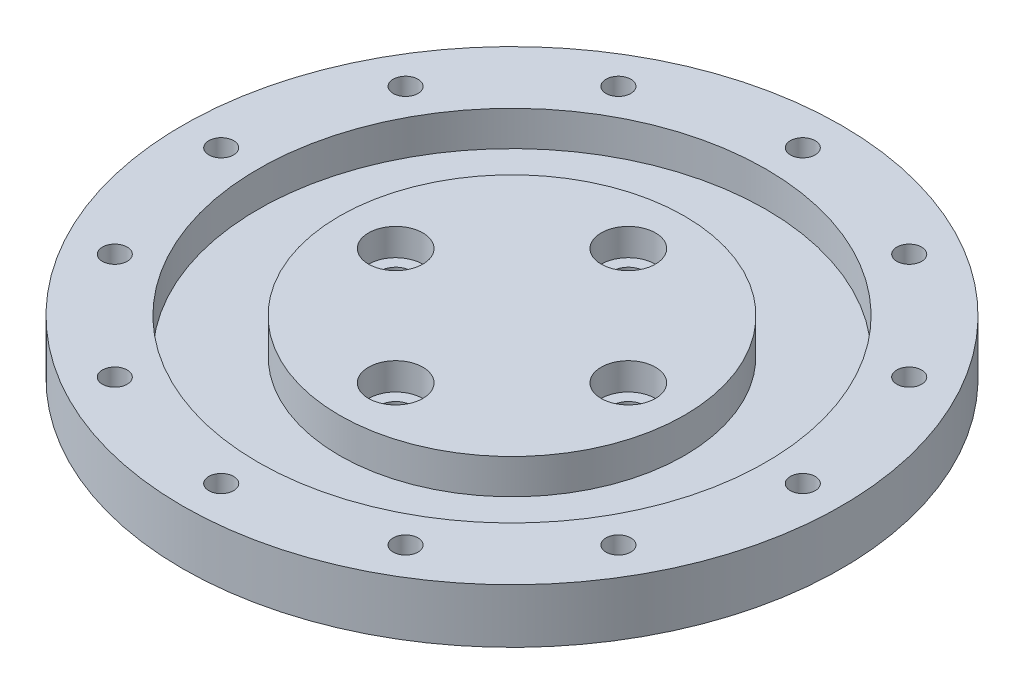
ISO-10303-21;
HEADER;
FILE_DESCRIPTION(('STEP AP214'),'2;1');
FILE_NAME('part.step','',(''),(''),'','','');
FILE_SCHEMA(('AUTOMOTIVE_DESIGN { 1 0 10303 214 1 1 1 1 }'));
ENDSEC;
DATA;
#1=APPLICATION_CONTEXT('core data for automotive mechanical design processes');
#2=APPLICATION_PROTOCOL_DEFINITION('international standard','automotive_design',2000,#1);
#3=PRODUCT_CONTEXT('',#1,'mechanical');
#4=PRODUCT('Part','Part','',(#3));
#5=PRODUCT_RELATED_PRODUCT_CATEGORY('part','',(#4));
#6=PRODUCT_DEFINITION_FORMATION('','',#4);
#7=PRODUCT_DEFINITION_CONTEXT('part definition',#1,'design');
#8=PRODUCT_DEFINITION('design','',#6,#7);
#9=PRODUCT_DEFINITION_SHAPE('','',#8);
#10=(LENGTH_UNIT() NAMED_UNIT(*) SI_UNIT(.MILLI.,.METRE.));
#11=(NAMED_UNIT(*) PLANE_ANGLE_UNIT() SI_UNIT($,.RADIAN.));
#12=(NAMED_UNIT(*) SI_UNIT($,.STERADIAN.) SOLID_ANGLE_UNIT());
#13=UNCERTAINTY_MEASURE_WITH_UNIT(LENGTH_MEASURE(1.E-05),#10,'distance_accuracy_value','');
#14=(GEOMETRIC_REPRESENTATION_CONTEXT(3) GLOBAL_UNCERTAINTY_ASSIGNED_CONTEXT((#13)) GLOBAL_UNIT_ASSIGNED_CONTEXT((#10,
#11,#12)) REPRESENTATION_CONTEXT('',''));
#15=CARTESIAN_POINT('',(0.,0.,0.));
#16=DIRECTION('',(0.,0.,1.));
#17=DIRECTION('',(1.,0.,0.));
#18=AXIS2_PLACEMENT_3D('',#15,#16,#17);
#19=CARTESIAN_POINT('',(-14.9999999999996,0.,4.254071563567E-13));
#20=DIRECTION('',(0.,1.,0.));
#21=DIRECTION('',(0.,0.,1.));
#22=AXIS2_PLACEMENT_3D('',#19,#20,#21);
#23=CYLINDRICAL_SURFACE('',#22,2.00000000000068);
#24=CARTESIAN_POINT('',(-14.9999999999996,0.,4.254071563567E-13));
#25=DIRECTION('',(0.,1.,0.));
#26=DIRECTION('',(0.,0.,1.));
#27=AXIS2_PLACEMENT_3D('',#24,#25,#26);
#28=CIRCLE('',#27,2.00000000000068);
#29=CARTESIAN_POINT('',(-14.9999999999996,0.,2.00000000000111));
#30=VERTEX_POINT('',#29);
#31=EDGE_CURVE('E69',#30,#30,#28,.T.);
#32=ORIENTED_EDGE('',*,*,#31,.F.);
#33=EDGE_LOOP('',(#32));
#34=FACE_BOUND('',#33,.T.);
#35=CARTESIAN_POINT('',(-14.9999999999996,3.5,4.254071563567E-13));
#36=DIRECTION('',(0.,1.,0.));
#37=DIRECTION('',(0.,0.,1.));
#38=AXIS2_PLACEMENT_3D('',#35,#36,#37);
#39=CIRCLE('',#38,2.00000000000068);
#40=CARTESIAN_POINT('',(-14.9999999999996,3.5,2.00000000000111));
#41=VERTEX_POINT('',#40);
#42=EDGE_CURVE('E41',#41,#41,#39,.F.);
#43=ORIENTED_EDGE('',*,*,#42,.F.);
#44=EDGE_LOOP('',(#43));
#45=FACE_BOUND('',#44,.T.);
#46=ADVANCED_FACE('F37',(#34,#45),#23,.F.);
#47=CARTESIAN_POINT('',(8.47140372315957E-13,0.,15.));
#48=DIRECTION('',(0.,1.,0.));
#49=DIRECTION('',(0.,0.,1.));
#50=AXIS2_PLACEMENT_3D('',#47,#48,#49);
#51=CYLINDRICAL_SURFACE('',#50,2.00000000000091);
#52=CARTESIAN_POINT('',(8.47140372315957E-13,0.,15.));
#53=DIRECTION('',(0.,1.,0.));
#54=DIRECTION('',(0.,0.,1.));
#55=AXIS2_PLACEMENT_3D('',#52,#53,#54);
#56=CIRCLE('',#55,2.00000000000091);
#57=CARTESIAN_POINT('',(8.47140372315957E-13,0.,17.0000000000009));
#58=VERTEX_POINT('',#57);
#59=EDGE_CURVE('E74',#58,#58,#56,.T.);
#60=ORIENTED_EDGE('',*,*,#59,.F.);
#61=EDGE_LOOP('',(#60));
#62=FACE_BOUND('',#61,.T.);
#63=CARTESIAN_POINT('',(8.47140372315957E-13,3.5,15.));
#64=DIRECTION('',(0.,1.,0.));
#65=DIRECTION('',(0.,0.,1.));
#66=AXIS2_PLACEMENT_3D('',#63,#64,#65);
#67=CIRCLE('',#66,2.00000000000091);
#68=CARTESIAN_POINT('',(8.47140372315957E-13,3.5,17.0000000000009));
#69=VERTEX_POINT('',#68);
#70=EDGE_CURVE('E61',#69,#69,#67,.F.);
#71=ORIENTED_EDGE('',*,*,#70,.F.);
#72=EDGE_LOOP('',(#71));
#73=FACE_BOUND('',#72,.T.);
#74=ADVANCED_FACE('F219',(#62,#73),#51,.F.);
#75=CARTESIAN_POINT('',(15.0000000000004,0.,-4.23570186157979E-13));
#76=DIRECTION('',(0.,1.,0.));
#77=DIRECTION('',(0.,0.,1.));
#78=AXIS2_PLACEMENT_3D('',#75,#76,#77);
#79=CYLINDRICAL_SURFACE('',#78,2.00000000000033);
#80=CARTESIAN_POINT('',(15.0000000000004,0.,-4.23570186157979E-13));
#81=DIRECTION('',(0.,1.,0.));
#82=DIRECTION('',(0.,0.,1.));
#83=AXIS2_PLACEMENT_3D('',#80,#81,#82);
#84=CIRCLE('',#83,2.00000000000033);
#85=CARTESIAN_POINT('',(15.0000000000004,0.,1.99999999999991));
#86=VERTEX_POINT('',#85);
#87=EDGE_CURVE('E80',#86,#86,#84,.T.);
#88=ORIENTED_EDGE('',*,*,#87,.F.);
#89=EDGE_LOOP('',(#88));
#90=FACE_BOUND('',#89,.T.);
#91=CARTESIAN_POINT('',(15.0000000000004,3.5,-4.23570186157979E-13));
#92=DIRECTION('',(0.,1.,0.));
#93=DIRECTION('',(0.,0.,1.));
#94=AXIS2_PLACEMENT_3D('',#91,#92,#93);
#95=CIRCLE('',#94,2.00000000000033);
#96=CARTESIAN_POINT('',(15.0000000000004,3.5,1.99999999999991));
#97=VERTEX_POINT('',#96);
#98=EDGE_CURVE('E58',#97,#97,#95,.F.);
#99=ORIENTED_EDGE('',*,*,#98,.F.);
#100=EDGE_LOOP('',(#99));
#101=FACE_BOUND('',#100,.T.);
#102=ADVANCED_FACE('F225',(#90,#101),#79,.F.);
#103=CARTESIAN_POINT('',(0.,0.,-15.));
#104=DIRECTION('',(0.,1.,0.));
#105=DIRECTION('',(0.,0.,1.));
#106=AXIS2_PLACEMENT_3D('',#103,#104,#105);
#107=CYLINDRICAL_SURFACE('',#106,2.);
#108=CARTESIAN_POINT('',(0.,0.,-15.));
#109=DIRECTION('',(0.,1.,0.));
#110=DIRECTION('',(0.,0.,1.));
#111=AXIS2_PLACEMENT_3D('',#108,#109,#110);
#112=CIRCLE('',#111,2.);
#113=CARTESIAN_POINT('',(0.,0.,-13.));
#114=VERTEX_POINT('',#113);
#115=EDGE_CURVE('E119',#114,#114,#112,.T.);
#116=ORIENTED_EDGE('',*,*,#115,.F.);
#117=EDGE_LOOP('',(#116));
#118=FACE_BOUND('',#117,.T.);
#119=CARTESIAN_POINT('',(0.,3.5,-15.));
#120=DIRECTION('',(0.,1.,0.));
#121=DIRECTION('',(0.,0.,1.));
#122=AXIS2_PLACEMENT_3D('',#119,#120,#121);
#123=CIRCLE('',#122,2.);
#124=CARTESIAN_POINT('',(0.,3.5,-13.));
#125=VERTEX_POINT('',#124);
#126=EDGE_CURVE('E510',#125,#125,#123,.T.);
#127=ORIENTED_EDGE('',*,*,#126,.T.);
#128=EDGE_LOOP('',(#127));
#129=FACE_BOUND('',#128,.T.);
#130=ADVANCED_FACE('F209',(#118,#129),#107,.F.);
#131=CARTESIAN_POINT('',(0.,7.,0.));
#132=DIRECTION('',(0.,-1.,0.));
#133=DIRECTION('',(0.,0.,-1.));
#134=AXIS2_PLACEMENT_3D('',#131,#132,#133);
#135=CYLINDRICAL_SURFACE('',#134,42.5);
#136=CARTESIAN_POINT('',(0.,7.,0.));
#137=DIRECTION('',(0.,1.,0.));
#138=DIRECTION('',(0.,0.,1.));
#139=AXIS2_PLACEMENT_3D('',#136,#137,#138);
#140=CIRCLE('',#139,42.5);
#141=CARTESIAN_POINT('',(0.,7.,42.5));
#142=VERTEX_POINT('',#141);
#143=EDGE_CURVE('E10',#142,#142,#140,.T.);
#144=ORIENTED_EDGE('',*,*,#143,.F.);
#145=EDGE_LOOP('',(#144));
#146=FACE_BOUND('',#145,.T.);
#147=CARTESIAN_POINT('',(0.,0.,0.));
#148=DIRECTION('',(0.,1.,0.));
#149=DIRECTION('',(0.,0.,1.));
#150=AXIS2_PLACEMENT_3D('',#147,#148,#149);
#151=CIRCLE('',#150,42.5);
#152=CARTESIAN_POINT('',(0.,0.,42.5));
#153=VERTEX_POINT('',#152);
#154=EDGE_CURVE('E46',#153,#153,#151,.T.);
#155=ORIENTED_EDGE('',*,*,#154,.T.);
#156=EDGE_LOOP('',(#155));
#157=FACE_BOUND('',#156,.T.);
#158=ADVANCED_FACE('F39',(#146,#157),#135,.T.);
#159=CARTESIAN_POINT('',(0.,7.,0.));
#160=DIRECTION('',(0.,1.,0.));
#161=DIRECTION('',(0.,0.,1.));
#162=AXIS2_PLACEMENT_3D('',#159,#160,#161);
#163=PLANE('',#162);
#164=CARTESIAN_POINT('',(0.,7.,-37.5));
#165=DIRECTION('',(0.,1.,0.));
#166=DIRECTION('',(0.,0.,1.));
#167=AXIS2_PLACEMENT_3D('',#164,#165,#166);
#168=CIRCLE('',#167,1.6);
#169=CARTESIAN_POINT('',(0.,7.,-35.9));
#170=VERTEX_POINT('',#169);
#171=EDGE_CURVE('E89',#170,#170,#168,.T.);
#172=ORIENTED_EDGE('',*,*,#171,.F.);
#173=EDGE_LOOP('',(#172));
#174=FACE_BOUND('',#173,.T.);
#175=CARTESIAN_POINT('',(-18.7499999999998,7.,-32.4759526419156));
#176=DIRECTION('',(0.,1.,0.));
#177=DIRECTION('',(0.,0.,1.));
#178=AXIS2_PLACEMENT_3D('',#175,#176,#177);
#179=CIRCLE('',#178,1.60000000000092);
#180=CARTESIAN_POINT('',(-18.7499999999998,7.,-30.8759526419147));
#181=VERTEX_POINT('',#180);
#182=EDGE_CURVE('E115',#181,#181,#179,.T.);
#183=ORIENTED_EDGE('',*,*,#182,.F.);
#184=EDGE_LOOP('',(#183));
#185=FACE_BOUND('',#184,.T.);
#186=CARTESIAN_POINT('',(-32.4759526419157,7.,-18.7499999999986));
#187=DIRECTION('',(0.,1.,0.));
#188=DIRECTION('',(0.,0.,1.));
#189=AXIS2_PLACEMENT_3D('',#186,#187,#188);
#190=CIRCLE('',#189,1.60000000000161);
#191=CARTESIAN_POINT('',(-32.4759526419157,7.,-17.149999999997));
#192=VERTEX_POINT('',#191);
#193=EDGE_CURVE('E107',#192,#192,#190,.T.);
#194=ORIENTED_EDGE('',*,*,#193,.F.);
#195=EDGE_LOOP('',(#194));
#196=FACE_BOUND('',#195,.T.);
#197=CARTESIAN_POINT('',(-37.4999999999984,7.,1.59642494271182E-12));
#198=DIRECTION('',(0.,1.,0.));
#199=DIRECTION('',(0.,0.,1.));
#200=AXIS2_PLACEMENT_3D('',#197,#198,#199);
#201=CIRCLE('',#200,1.60000000000237);
#202=CARTESIAN_POINT('',(-37.4999999999984,7.,1.60000000000396));
#203=VERTEX_POINT('',#202);
#204=EDGE_CURVE('E99',#203,#203,#201,.T.);
#205=ORIENTED_EDGE('',*,*,#204,.F.);
#206=EDGE_LOOP('',(#205));
#207=FACE_BOUND('',#206,.T.);
#208=CARTESIAN_POINT('',(18.75,7.,-32.4759526419164));
#209=DIRECTION('',(0.,1.,0.));
#210=DIRECTION('',(0.,0.,1.));
#211=AXIS2_PLACEMENT_3D('',#208,#209,#210);
#212=CIRCLE('',#211,1.6);
#213=CARTESIAN_POINT('',(18.75,7.,-30.8759526419164));
#214=VERTEX_POINT('',#213);
#215=EDGE_CURVE('E155',#214,#214,#212,.T.);
#216=ORIENTED_EDGE('',*,*,#215,.F.);
#217=EDGE_LOOP('',(#216));
#218=FACE_BOUND('',#217,.T.);
#219=CARTESIAN_POINT('',(32.4759526419172,7.,-18.7500000000014));
#220=DIRECTION('',(0.,1.,0.));
#221=DIRECTION('',(0.,0.,1.));
#222=AXIS2_PLACEMENT_3D('',#219,#220,#221);
#223=CIRCLE('',#222,1.60000000000044);
#224=CARTESIAN_POINT('',(32.4759526419172,7.,-17.1500000000009));
#225=VERTEX_POINT('',#224);
#226=EDGE_CURVE('E163',#225,#225,#223,.T.);
#227=ORIENTED_EDGE('',*,*,#226,.F.);
#228=EDGE_LOOP('',(#227));
#229=FACE_BOUND('',#228,.T.);
#230=CARTESIAN_POINT('',(37.5000000000016,7.,-1.59183251721502E-12));
#231=DIRECTION('',(0.,1.,0.));
#232=DIRECTION('',(0.,0.,1.));
#233=AXIS2_PLACEMENT_3D('',#230,#231,#232);
#234=CIRCLE('',#233,1.60000000000118);
#235=CARTESIAN_POINT('',(37.5000000000016,7.,1.59999999999959));
#236=VERTEX_POINT('',#235);
#237=EDGE_CURVE('E171',#236,#236,#234,.T.);
#238=ORIENTED_EDGE('',*,*,#237,.F.);
#239=EDGE_LOOP('',(#238));
#240=FACE_BOUND('',#239,.T.);
#241=CARTESIAN_POINT('',(32.4759526419188,7.,18.7499999999986));
#242=DIRECTION('',(0.,1.,0.));
#243=DIRECTION('',(0.,0.,1.));
#244=AXIS2_PLACEMENT_3D('',#241,#242,#243);
#245=CIRCLE('',#244,1.60000000000205);
#246=CARTESIAN_POINT('',(32.4759526419188,7.,20.3500000000007));
#247=VERTEX_POINT('',#246);
#248=EDGE_CURVE('E124',#247,#247,#245,.T.);
#249=ORIENTED_EDGE('',*,*,#248,.F.);
#250=EDGE_LOOP('',(#249));
#251=FACE_BOUND('',#250,.T.);
#252=CARTESIAN_POINT('',(18.750000000003,7.,32.4759526419156));
#253=DIRECTION('',(0.,1.,0.));
#254=DIRECTION('',(0.,0.,1.));
#255=AXIS2_PLACEMENT_3D('',#252,#253,#254);
#256=CIRCLE('',#255,1.60000000000283);
#257=CARTESIAN_POINT('',(18.750000000003,7.,34.0759526419185));
#258=VERTEX_POINT('',#257);
#259=EDGE_CURVE('E125',#258,#258,#256,.T.);
#260=ORIENTED_EDGE('',*,*,#259,.F.);
#261=EDGE_LOOP('',(#260));
#262=FACE_BOUND('',#261,.T.);
#263=CARTESIAN_POINT('',(3.18366503443004E-12,7.,37.5));
#264=DIRECTION('',(0.,1.,0.));
#265=DIRECTION('',(0.,0.,1.));
#266=AXIS2_PLACEMENT_3D('',#263,#264,#265);
#267=CIRCLE('',#266,1.60000000000329);
#268=CARTESIAN_POINT('',(3.18366503443004E-12,7.,39.1000000000033));
#269=VERTEX_POINT('',#268);
#270=EDGE_CURVE('E133',#269,#269,#267,.T.);
#271=ORIENTED_EDGE('',*,*,#270,.F.);
#272=EDGE_LOOP('',(#271));
#273=FACE_BOUND('',#272,.T.);
#274=CARTESIAN_POINT('',(-18.749999999997,7.,32.4759526419173));
#275=DIRECTION('',(0.,1.,0.));
#276=DIRECTION('',(0.,0.,1.));
#277=AXIS2_PLACEMENT_3D('',#274,#275,#276);
#278=CIRCLE('',#277,1.60000000000337);
#279=CARTESIAN_POINT('',(-18.749999999997,7.,34.0759526419206));
#280=VERTEX_POINT('',#279);
#281=EDGE_CURVE('E141',#280,#280,#278,.T.);
#282=ORIENTED_EDGE('',*,*,#281,.F.);
#283=EDGE_LOOP('',(#282));
#284=FACE_BOUND('',#283,.T.);
#285=CARTESIAN_POINT('',(-32.475952641914,7.,18.7500000000014));
#286=DIRECTION('',(0.,1.,0.));
#287=DIRECTION('',(0.,0.,1.));
#288=AXIS2_PLACEMENT_3D('',#285,#286,#287);
#289=CIRCLE('',#288,1.60000000000303);
#290=CARTESIAN_POINT('',(-32.475952641914,7.,20.3500000000044));
#291=VERTEX_POINT('',#290);
#292=EDGE_CURVE('E98',#291,#291,#289,.T.);
#293=ORIENTED_EDGE('',*,*,#292,.F.);
#294=EDGE_LOOP('',(#293));
#295=FACE_BOUND('',#294,.T.);
#296=CARTESIAN_POINT('',(0.,7.,0.));
#297=DIRECTION('',(0.,1.,0.));
#298=DIRECTION('',(0.,0.,1.));
#299=AXIS2_PLACEMENT_3D('',#296,#297,#298);
#300=CIRCLE('',#299,32.75);
#301=CARTESIAN_POINT('',(0.,7.,32.75));
#302=VERTEX_POINT('',#301);
#303=EDGE_CURVE('E55',#302,#302,#300,.T.);
#304=ORIENTED_EDGE('',*,*,#303,.F.);
#305=EDGE_LOOP('',(#304));
#306=FACE_BOUND('',#305,.T.);
#307=ORIENTED_EDGE('',*,*,#143,.T.);
#308=EDGE_LOOP('',(#307));
#309=FACE_BOUND('',#308,.T.);
#310=ADVANCED_FACE('F198',(#174,#185,#196,#207,#218,#229,#240,#251,#262,#273,#284,#295,#306,
#309),#163,.T.);
#311=CARTESIAN_POINT('',(0.,0.,0.));
#312=DIRECTION('',(0.,1.,0.));
#313=DIRECTION('',(0.,0.,1.));
#314=AXIS2_PLACEMENT_3D('',#311,#312,#313);
#315=PLANE('',#314);
#316=ORIENTED_EDGE('',*,*,#115,.T.);
#317=EDGE_LOOP('',(#316));
#318=FACE_BOUND('',#317,.T.);
#319=ORIENTED_EDGE('',*,*,#87,.T.);
#320=EDGE_LOOP('',(#319));
#321=FACE_BOUND('',#320,.T.);
#322=ORIENTED_EDGE('',*,*,#59,.T.);
#323=EDGE_LOOP('',(#322));
#324=FACE_BOUND('',#323,.T.);
#325=ORIENTED_EDGE('',*,*,#31,.T.);
#326=EDGE_LOOP('',(#325));
#327=FACE_BOUND('',#326,.T.);
#328=CARTESIAN_POINT('',(0.,0.,-37.5));
#329=DIRECTION('',(0.,1.,0.));
#330=DIRECTION('',(0.,0.,1.));
#331=AXIS2_PLACEMENT_3D('',#328,#329,#330);
#332=CIRCLE('',#331,1.6);
#333=CARTESIAN_POINT('',(0.,0.,-35.9));
#334=VERTEX_POINT('',#333);
#335=EDGE_CURVE('E84',#334,#334,#332,.T.);
#336=ORIENTED_EDGE('',*,*,#335,.T.);
#337=EDGE_LOOP('',(#336));
#338=FACE_BOUND('',#337,.T.);
#339=CARTESIAN_POINT('',(-18.7499999999998,0.,-32.4759526419156));
#340=DIRECTION('',(0.,1.,0.));
#341=DIRECTION('',(0.,0.,1.));
#342=AXIS2_PLACEMENT_3D('',#339,#340,#341);
#343=CIRCLE('',#342,1.60000000000092);
#344=CARTESIAN_POINT('',(-18.7499999999998,0.,-30.8759526419147));
#345=VERTEX_POINT('',#344);
#346=EDGE_CURVE('E111',#345,#345,#343,.T.);
#347=ORIENTED_EDGE('',*,*,#346,.T.);
#348=EDGE_LOOP('',(#347));
#349=FACE_BOUND('',#348,.T.);
#350=CARTESIAN_POINT('',(-32.4759526419157,0.,-18.7499999999986));
#351=DIRECTION('',(0.,1.,0.));
#352=DIRECTION('',(0.,0.,1.));
#353=AXIS2_PLACEMENT_3D('',#350,#351,#352);
#354=CIRCLE('',#353,1.60000000000161);
#355=CARTESIAN_POINT('',(-32.4759526419157,0.,-17.149999999997));
#356=VERTEX_POINT('',#355);
#357=EDGE_CURVE('E103',#356,#356,#354,.T.);
#358=ORIENTED_EDGE('',*,*,#357,.T.);
#359=EDGE_LOOP('',(#358));
#360=FACE_BOUND('',#359,.T.);
#361=CARTESIAN_POINT('',(-37.4999999999984,0.,1.59642494271182E-12));
#362=DIRECTION('',(0.,1.,0.));
#363=DIRECTION('',(0.,0.,1.));
#364=AXIS2_PLACEMENT_3D('',#361,#362,#363);
#365=CIRCLE('',#364,1.60000000000237);
#366=CARTESIAN_POINT('',(-37.4999999999984,0.,1.60000000000396));
#367=VERTEX_POINT('',#366);
#368=EDGE_CURVE('E94',#367,#367,#365,.T.);
#369=ORIENTED_EDGE('',*,*,#368,.T.);
#370=EDGE_LOOP('',(#369));
#371=FACE_BOUND('',#370,.T.);
#372=CARTESIAN_POINT('',(18.75,0.,-32.4759526419164));
#373=DIRECTION('',(0.,1.,0.));
#374=DIRECTION('',(0.,0.,1.));
#375=AXIS2_PLACEMENT_3D('',#372,#373,#374);
#376=CIRCLE('',#375,1.6);
#377=CARTESIAN_POINT('',(18.75,0.,-30.8759526419164));
#378=VERTEX_POINT('',#377);
#379=EDGE_CURVE('E93',#378,#378,#376,.T.);
#380=ORIENTED_EDGE('',*,*,#379,.T.);
#381=EDGE_LOOP('',(#380));
#382=FACE_BOUND('',#381,.T.);
#383=CARTESIAN_POINT('',(32.4759526419172,0.,-18.7500000000014));
#384=DIRECTION('',(0.,1.,0.));
#385=DIRECTION('',(0.,0.,1.));
#386=AXIS2_PLACEMENT_3D('',#383,#384,#385);
#387=CIRCLE('',#386,1.60000000000044);
#388=CARTESIAN_POINT('',(32.4759526419172,0.,-17.1500000000009));
#389=VERTEX_POINT('',#388);
#390=EDGE_CURVE('E159',#389,#389,#387,.T.);
#391=ORIENTED_EDGE('',*,*,#390,.T.);
#392=EDGE_LOOP('',(#391));
#393=FACE_BOUND('',#392,.T.);
#394=CARTESIAN_POINT('',(37.5000000000016,0.,-1.59183251721502E-12));
#395=DIRECTION('',(0.,1.,0.));
#396=DIRECTION('',(0.,0.,1.));
#397=AXIS2_PLACEMENT_3D('',#394,#395,#396);
#398=CIRCLE('',#397,1.60000000000118);
#399=CARTESIAN_POINT('',(37.5000000000016,0.,1.59999999999959));
#400=VERTEX_POINT('',#399);
#401=EDGE_CURVE('E167',#400,#400,#398,.T.);
#402=ORIENTED_EDGE('',*,*,#401,.T.);
#403=EDGE_LOOP('',(#402));
#404=FACE_BOUND('',#403,.T.);
#405=CARTESIAN_POINT('',(32.4759526419188,0.,18.7499999999986));
#406=DIRECTION('',(0.,1.,0.));
#407=DIRECTION('',(0.,0.,1.));
#408=AXIS2_PLACEMENT_3D('',#405,#406,#407);
#409=CIRCLE('',#408,1.60000000000205);
#410=CARTESIAN_POINT('',(32.4759526419188,0.,20.3500000000007));
#411=VERTEX_POINT('',#410);
#412=EDGE_CURVE('E175',#411,#411,#409,.T.);
#413=ORIENTED_EDGE('',*,*,#412,.T.);
#414=EDGE_LOOP('',(#413));
#415=FACE_BOUND('',#414,.T.);
#416=CARTESIAN_POINT('',(18.750000000003,0.,32.4759526419156));
#417=DIRECTION('',(0.,1.,0.));
#418=DIRECTION('',(0.,0.,1.));
#419=AXIS2_PLACEMENT_3D('',#416,#417,#418);
#420=CIRCLE('',#419,1.60000000000283);
#421=CARTESIAN_POINT('',(18.750000000003,0.,34.0759526419185));
#422=VERTEX_POINT('',#421);
#423=EDGE_CURVE('E120',#422,#422,#420,.T.);
#424=ORIENTED_EDGE('',*,*,#423,.T.);
#425=EDGE_LOOP('',(#424));
#426=FACE_BOUND('',#425,.T.);
#427=CARTESIAN_POINT('',(3.18366503443004E-12,0.,37.5));
#428=DIRECTION('',(0.,1.,0.));
#429=DIRECTION('',(0.,0.,1.));
#430=AXIS2_PLACEMENT_3D('',#427,#428,#429);
#431=CIRCLE('',#430,1.60000000000329);
#432=CARTESIAN_POINT('',(3.18366503443004E-12,0.,39.1000000000033));
#433=VERTEX_POINT('',#432);
#434=EDGE_CURVE('E129',#433,#433,#431,.T.);
#435=ORIENTED_EDGE('',*,*,#434,.T.);
#436=EDGE_LOOP('',(#435));
#437=FACE_BOUND('',#436,.T.);
#438=CARTESIAN_POINT('',(-18.749999999997,0.,32.4759526419173));
#439=DIRECTION('',(0.,1.,0.));
#440=DIRECTION('',(0.,0.,1.));
#441=AXIS2_PLACEMENT_3D('',#438,#439,#440);
#442=CIRCLE('',#441,1.60000000000337);
#443=CARTESIAN_POINT('',(-18.749999999997,0.,34.0759526419206));
#444=VERTEX_POINT('',#443);
#445=EDGE_CURVE('E137',#444,#444,#442,.T.);
#446=ORIENTED_EDGE('',*,*,#445,.T.);
#447=EDGE_LOOP('',(#446));
#448=FACE_BOUND('',#447,.T.);
#449=CARTESIAN_POINT('',(-32.475952641914,0.,18.7500000000014));
#450=DIRECTION('',(0.,1.,0.));
#451=DIRECTION('',(0.,0.,1.));
#452=AXIS2_PLACEMENT_3D('',#449,#450,#451);
#453=CIRCLE('',#452,1.60000000000303);
#454=CARTESIAN_POINT('',(-32.475952641914,0.,20.3500000000044));
#455=VERTEX_POINT('',#454);
#456=EDGE_CURVE('E145',#455,#455,#453,.T.);
#457=ORIENTED_EDGE('',*,*,#456,.T.);
#458=EDGE_LOOP('',(#457));
#459=FACE_BOUND('',#458,.T.);
#460=ORIENTED_EDGE('',*,*,#154,.F.);
#461=EDGE_LOOP('',(#460));
#462=FACE_BOUND('',#461,.T.);
#463=ADVANCED_FACE('F200',(#318,#321,#324,#327,#338,#349,#360,#371,#382,#393,#404,#415,#426,
#437,#448,#459,#462),#315,.F.);
#464=CARTESIAN_POINT('',(0.,2.5,0.));
#465=DIRECTION('',(0.,1.,0.));
#466=DIRECTION('',(0.,0.,1.));
#467=AXIS2_PLACEMENT_3D('',#464,#465,#466);
#468=CYLINDRICAL_SURFACE('',#467,32.75);
#469=CARTESIAN_POINT('',(0.,2.5,0.));
#470=DIRECTION('',(0.,1.,0.));
#471=DIRECTION('',(0.,0.,1.));
#472=AXIS2_PLACEMENT_3D('',#469,#470,#471);
#473=CIRCLE('',#472,32.75);
#474=CARTESIAN_POINT('',(0.,2.5,32.75));
#475=VERTEX_POINT('',#474);
#476=EDGE_CURVE('E52',#475,#475,#473,.T.);
#477=ORIENTED_EDGE('',*,*,#476,.F.);
#478=EDGE_LOOP('',(#477));
#479=FACE_BOUND('',#478,.T.);
#480=ORIENTED_EDGE('',*,*,#303,.T.);
#481=EDGE_LOOP('',(#480));
#482=FACE_BOUND('',#481,.T.);
#483=ADVANCED_FACE('F196',(#479,#482),#468,.F.);
#484=CARTESIAN_POINT('',(0.,2.5,0.));
#485=DIRECTION('',(0.,1.,0.));
#486=DIRECTION('',(0.,0.,1.));
#487=AXIS2_PLACEMENT_3D('',#484,#485,#486);
#488=PLANE('',#487);
#489=CARTESIAN_POINT('',(0.,2.5,0.));
#490=DIRECTION('',(0.,1.,0.));
#491=DIRECTION('',(0.,0.,1.));
#492=AXIS2_PLACEMENT_3D('',#489,#490,#491);
#493=CIRCLE('',#492,22.25);
#494=CARTESIAN_POINT('',(0.,2.5,22.25));
#495=VERTEX_POINT('',#494);
#496=EDGE_CURVE('E182',#495,#495,#493,.T.);
#497=ORIENTED_EDGE('',*,*,#496,.F.);
#498=EDGE_LOOP('',(#497));
#499=FACE_BOUND('',#498,.T.);
#500=ORIENTED_EDGE('',*,*,#476,.T.);
#501=EDGE_LOOP('',(#500));
#502=FACE_BOUND('',#501,.T.);
#503=ADVANCED_FACE('F281',(#499,#502),#488,.T.);
#504=CARTESIAN_POINT('',(0.,2.5,0.));
#505=DIRECTION('',(0.,1.,0.));
#506=DIRECTION('',(0.,0.,1.));
#507=AXIS2_PLACEMENT_3D('',#504,#505,#506);
#508=CYLINDRICAL_SURFACE('',#507,22.25);
#509=ORIENTED_EDGE('',*,*,#496,.T.);
#510=EDGE_LOOP('',(#509));
#511=FACE_BOUND('',#510,.T.);
#512=CARTESIAN_POINT('',(0.,7.,0.));
#513=DIRECTION('',(0.,1.,0.));
#514=DIRECTION('',(0.,0.,1.));
#515=AXIS2_PLACEMENT_3D('',#512,#513,#514);
#516=CIRCLE('',#515,22.25);
#517=CARTESIAN_POINT('',(0.,7.,22.25));
#518=VERTEX_POINT('',#517);
#519=EDGE_CURVE('E88',#518,#518,#516,.T.);
#520=ORIENTED_EDGE('',*,*,#519,.F.);
#521=EDGE_LOOP('',(#520));
#522=FACE_BOUND('',#521,.T.);
#523=ADVANCED_FACE('F216',(#511,#522),#508,.T.);
#524=CARTESIAN_POINT('',(0.,7.,-15.));
#525=DIRECTION('',(0.,1.,0.));
#526=DIRECTION('',(0.,0.,1.));
#527=AXIS2_PLACEMENT_3D('',#524,#525,#526);
#528=CIRCLE('',#527,3.5);
#529=CARTESIAN_POINT('',(0.,7.,-11.5));
#530=VERTEX_POINT('',#529);
#531=EDGE_CURVE('E512',#530,#530,#528,.T.);
#532=ORIENTED_EDGE('',*,*,#531,.F.);
#533=EDGE_LOOP('',(#532));
#534=FACE_BOUND('',#533,.T.);
#535=CARTESIAN_POINT('',(15.0000000000004,7.,-4.23570186157979E-13));
#536=DIRECTION('',(0.,1.,0.));
#537=DIRECTION('',(0.,0.,1.));
#538=AXIS2_PLACEMENT_3D('',#535,#536,#537);
#539=CIRCLE('',#538,3.50000000000033);
#540=CARTESIAN_POINT('',(15.0000000000004,7.,3.49999999999991));
#541=VERTEX_POINT('',#540);
#542=EDGE_CURVE('E520',#541,#541,#539,.T.);
#543=ORIENTED_EDGE('',*,*,#542,.F.);
#544=EDGE_LOOP('',(#543));
#545=FACE_BOUND('',#544,.T.);
#546=CARTESIAN_POINT('',(8.47140372315957E-13,7.,15.));
#547=DIRECTION('',(0.,1.,0.));
#548=DIRECTION('',(0.,0.,1.));
#549=AXIS2_PLACEMENT_3D('',#546,#547,#548);
#550=CIRCLE('',#549,3.50000000000091);
#551=CARTESIAN_POINT('',(8.47140372315957E-13,7.,18.5000000000009));
#552=VERTEX_POINT('',#551);
#553=EDGE_CURVE('E533',#552,#552,#550,.T.);
#554=ORIENTED_EDGE('',*,*,#553,.F.);
#555=EDGE_LOOP('',(#554));
#556=FACE_BOUND('',#555,.T.);
#557=CARTESIAN_POINT('',(-14.9999999999996,7.,4.254071563567E-13));
#558=DIRECTION('',(0.,1.,0.));
#559=DIRECTION('',(0.,0.,1.));
#560=AXIS2_PLACEMENT_3D('',#557,#558,#559);
#561=CIRCLE('',#560,3.50000000000068);
#562=CARTESIAN_POINT('',(-14.9999999999996,7.,3.50000000000111));
#563=VERTEX_POINT('',#562);
#564=EDGE_CURVE('E541',#563,#563,#561,.T.);
#565=ORIENTED_EDGE('',*,*,#564,.F.);
#566=EDGE_LOOP('',(#565));
#567=FACE_BOUND('',#566,.T.);
#568=ORIENTED_EDGE('',*,*,#519,.T.);
#569=EDGE_LOOP('',(#568));
#570=FACE_BOUND('',#569,.T.);
#571=ADVANCED_FACE('F203',(#534,#545,#556,#567,#570),#163,.T.);
#572=CARTESIAN_POINT('',(-32.475952641914,0.,18.7500000000014));
#573=DIRECTION('',(0.,1.,0.));
#574=DIRECTION('',(0.,0.,1.));
#575=AXIS2_PLACEMENT_3D('',#572,#573,#574);
#576=CYLINDRICAL_SURFACE('',#575,1.60000000000303);
#577=ORIENTED_EDGE('',*,*,#456,.F.);
#578=EDGE_LOOP('',(#577));
#579=FACE_BOUND('',#578,.T.);
#580=ORIENTED_EDGE('',*,*,#292,.T.);
#581=EDGE_LOOP('',(#580));
#582=FACE_BOUND('',#581,.T.);
#583=ADVANCED_FACE('F215',(#579,#582),#576,.F.);
#584=CARTESIAN_POINT('',(-18.749999999997,0.,32.4759526419173));
#585=DIRECTION('',(0.,1.,0.));
#586=DIRECTION('',(0.,0.,1.));
#587=AXIS2_PLACEMENT_3D('',#584,#585,#586);
#588=CYLINDRICAL_SURFACE('',#587,1.60000000000337);
#589=ORIENTED_EDGE('',*,*,#445,.F.);
#590=EDGE_LOOP('',(#589));
#591=FACE_BOUND('',#590,.T.);
#592=ORIENTED_EDGE('',*,*,#281,.T.);
#593=EDGE_LOOP('',(#592));
#594=FACE_BOUND('',#593,.T.);
#595=ADVANCED_FACE('F257',(#591,#594),#588,.F.);
#596=CARTESIAN_POINT('',(3.18366503443004E-12,0.,37.5));
#597=DIRECTION('',(0.,1.,0.));
#598=DIRECTION('',(0.,0.,1.));
#599=AXIS2_PLACEMENT_3D('',#596,#597,#598);
#600=CYLINDRICAL_SURFACE('',#599,1.60000000000329);
#601=ORIENTED_EDGE('',*,*,#434,.F.);
#602=EDGE_LOOP('',(#601));
#603=FACE_BOUND('',#602,.T.);
#604=ORIENTED_EDGE('',*,*,#270,.T.);
#605=EDGE_LOOP('',(#604));
#606=FACE_BOUND('',#605,.T.);
#607=ADVANCED_FACE('F253',(#603,#606),#600,.F.);
#608=CARTESIAN_POINT('',(18.750000000003,0.,32.4759526419156));
#609=DIRECTION('',(0.,1.,0.));
#610=DIRECTION('',(0.,0.,1.));
#611=AXIS2_PLACEMENT_3D('',#608,#609,#610);
#612=CYLINDRICAL_SURFACE('',#611,1.60000000000283);
#613=ORIENTED_EDGE('',*,*,#423,.F.);
#614=EDGE_LOOP('',(#613));
#615=FACE_BOUND('',#614,.T.);
#616=ORIENTED_EDGE('',*,*,#259,.T.);
#617=EDGE_LOOP('',(#616));
#618=FACE_BOUND('',#617,.T.);
#619=ADVANCED_FACE('F249',(#615,#618),#612,.F.);
#620=CARTESIAN_POINT('',(32.4759526419188,0.,18.7499999999986));
#621=DIRECTION('',(0.,1.,0.));
#622=DIRECTION('',(0.,0.,1.));
#623=AXIS2_PLACEMENT_3D('',#620,#621,#622);
#624=CYLINDRICAL_SURFACE('',#623,1.60000000000205);
#625=ORIENTED_EDGE('',*,*,#412,.F.);
#626=EDGE_LOOP('',(#625));
#627=FACE_BOUND('',#626,.T.);
#628=ORIENTED_EDGE('',*,*,#248,.T.);
#629=EDGE_LOOP('',(#628));
#630=FACE_BOUND('',#629,.T.);
#631=ADVANCED_FACE('F252',(#627,#630),#624,.F.);
#632=CARTESIAN_POINT('',(37.5000000000016,0.,-1.59183251721502E-12));
#633=DIRECTION('',(0.,1.,0.));
#634=DIRECTION('',(0.,0.,1.));
#635=AXIS2_PLACEMENT_3D('',#632,#633,#634);
#636=CYLINDRICAL_SURFACE('',#635,1.60000000000118);
#637=ORIENTED_EDGE('',*,*,#401,.F.);
#638=EDGE_LOOP('',(#637));
#639=FACE_BOUND('',#638,.T.);
#640=ORIENTED_EDGE('',*,*,#237,.T.);
#641=EDGE_LOOP('',(#640));
#642=FACE_BOUND('',#641,.T.);
#643=ADVANCED_FACE('F271',(#639,#642),#636,.F.);
#644=CARTESIAN_POINT('',(32.4759526419172,0.,-18.7500000000014));
#645=DIRECTION('',(0.,1.,0.));
#646=DIRECTION('',(0.,0.,1.));
#647=AXIS2_PLACEMENT_3D('',#644,#645,#646);
#648=CYLINDRICAL_SURFACE('',#647,1.60000000000044);
#649=ORIENTED_EDGE('',*,*,#390,.F.);
#650=EDGE_LOOP('',(#649));
#651=FACE_BOUND('',#650,.T.);
#652=ORIENTED_EDGE('',*,*,#226,.T.);
#653=EDGE_LOOP('',(#652));
#654=FACE_BOUND('',#653,.T.);
#655=ADVANCED_FACE('F267',(#651,#654),#648,.F.);
#656=CARTESIAN_POINT('',(18.75,0.,-32.4759526419164));
#657=DIRECTION('',(0.,1.,0.));
#658=DIRECTION('',(0.,0.,1.));
#659=AXIS2_PLACEMENT_3D('',#656,#657,#658);
#660=CYLINDRICAL_SURFACE('',#659,1.6);
#661=ORIENTED_EDGE('',*,*,#379,.F.);
#662=EDGE_LOOP('',(#661));
#663=FACE_BOUND('',#662,.T.);
#664=ORIENTED_EDGE('',*,*,#215,.T.);
#665=EDGE_LOOP('',(#664));
#666=FACE_BOUND('',#665,.T.);
#667=ADVANCED_FACE('F241',(#663,#666),#660,.F.);
#668=CARTESIAN_POINT('',(-37.4999999999984,0.,1.59642494271182E-12));
#669=DIRECTION('',(0.,1.,0.));
#670=DIRECTION('',(0.,0.,1.));
#671=AXIS2_PLACEMENT_3D('',#668,#669,#670);
#672=CYLINDRICAL_SURFACE('',#671,1.60000000000237);
#673=ORIENTED_EDGE('',*,*,#368,.F.);
#674=EDGE_LOOP('',(#673));
#675=FACE_BOUND('',#674,.T.);
#676=ORIENTED_EDGE('',*,*,#204,.T.);
#677=EDGE_LOOP('',(#676));
#678=FACE_BOUND('',#677,.T.);
#679=ADVANCED_FACE('F237',(#675,#678),#672,.F.);
#680=CARTESIAN_POINT('',(-32.4759526419157,0.,-18.7499999999986));
#681=DIRECTION('',(0.,1.,0.));
#682=DIRECTION('',(0.,0.,1.));
#683=AXIS2_PLACEMENT_3D('',#680,#681,#682);
#684=CYLINDRICAL_SURFACE('',#683,1.60000000000161);
#685=ORIENTED_EDGE('',*,*,#357,.F.);
#686=EDGE_LOOP('',(#685));
#687=FACE_BOUND('',#686,.T.);
#688=ORIENTED_EDGE('',*,*,#193,.T.);
#689=EDGE_LOOP('',(#688));
#690=FACE_BOUND('',#689,.T.);
#691=ADVANCED_FACE('F240',(#687,#690),#684,.F.);
#692=CARTESIAN_POINT('',(-18.7499999999998,0.,-32.4759526419156));
#693=DIRECTION('',(0.,1.,0.));
#694=DIRECTION('',(0.,0.,1.));
#695=AXIS2_PLACEMENT_3D('',#692,#693,#694);
#696=CYLINDRICAL_SURFACE('',#695,1.60000000000092);
#697=ORIENTED_EDGE('',*,*,#346,.F.);
#698=EDGE_LOOP('',(#697));
#699=FACE_BOUND('',#698,.T.);
#700=ORIENTED_EDGE('',*,*,#182,.T.);
#701=EDGE_LOOP('',(#700));
#702=FACE_BOUND('',#701,.T.);
#703=ADVANCED_FACE('F235',(#699,#702),#696,.F.);
#704=CARTESIAN_POINT('',(0.,0.,-37.5));
#705=DIRECTION('',(0.,1.,0.));
#706=DIRECTION('',(0.,0.,1.));
#707=AXIS2_PLACEMENT_3D('',#704,#705,#706);
#708=CYLINDRICAL_SURFACE('',#707,1.6);
#709=ORIENTED_EDGE('',*,*,#335,.F.);
#710=EDGE_LOOP('',(#709));
#711=FACE_BOUND('',#710,.T.);
#712=ORIENTED_EDGE('',*,*,#171,.T.);
#713=EDGE_LOOP('',(#712));
#714=FACE_BOUND('',#713,.T.);
#715=ADVANCED_FACE('F231',(#711,#714),#708,.F.);
#716=CARTESIAN_POINT('',(0.,3.5,-15.));
#717=DIRECTION('',(0.,1.,0.));
#718=DIRECTION('',(0.,0.,1.));
#719=AXIS2_PLACEMENT_3D('',#716,#717,#718);
#720=CYLINDRICAL_SURFACE('',#719,3.5);
#721=CARTESIAN_POINT('',(0.,3.5,-15.));
#722=DIRECTION('',(0.,1.,0.));
#723=DIRECTION('',(0.,0.,1.));
#724=AXIS2_PLACEMENT_3D('',#721,#722,#723);
#725=CIRCLE('',#724,3.5);
#726=CARTESIAN_POINT('',(0.,3.5,-11.5));
#727=VERTEX_POINT('',#726);
#728=EDGE_CURVE('E62',#727,#727,#725,.T.);
#729=ORIENTED_EDGE('',*,*,#728,.F.);
#730=EDGE_LOOP('',(#729));
#731=FACE_BOUND('',#730,.T.);
#732=ORIENTED_EDGE('',*,*,#531,.T.);
#733=EDGE_LOOP('',(#732));
#734=FACE_BOUND('',#733,.T.);
#735=ADVANCED_FACE('F234',(#731,#734),#720,.F.);
#736=CARTESIAN_POINT('',(0.,3.5,-15.));
#737=DIRECTION('',(0.,1.,0.));
#738=DIRECTION('',(0.,0.,1.));
#739=AXIS2_PLACEMENT_3D('',#736,#737,#738);
#740=PLANE('',#739);
#741=ORIENTED_EDGE('',*,*,#126,.F.);
#742=EDGE_LOOP('',(#741));
#743=FACE_BOUND('',#742,.T.);
#744=ORIENTED_EDGE('',*,*,#728,.T.);
#745=EDGE_LOOP('',(#744));
#746=FACE_BOUND('',#745,.T.);
#747=ADVANCED_FACE('F359',(#743,#746),#740,.T.);
#748=CARTESIAN_POINT('',(15.0000000000004,3.5,-4.23570186157979E-13));
#749=DIRECTION('',(0.,1.,0.));
#750=DIRECTION('',(0.,0.,1.));
#751=AXIS2_PLACEMENT_3D('',#748,#749,#750);
#752=PLANE('',#751);
#753=CARTESIAN_POINT('',(15.0000000000004,3.5,-4.23570186157979E-13));
#754=DIRECTION('',(0.,1.,0.));
#755=DIRECTION('',(0.,0.,1.));
#756=AXIS2_PLACEMENT_3D('',#753,#754,#755);
#757=CIRCLE('',#756,3.50000000000033);
#758=CARTESIAN_POINT('',(15.0000000000004,3.5,3.49999999999991));
#759=VERTEX_POINT('',#758);
#760=EDGE_CURVE('E513',#759,#759,#757,.T.);
#761=ORIENTED_EDGE('',*,*,#760,.T.);
#762=EDGE_LOOP('',(#761));
#763=FACE_BOUND('',#762,.T.);
#764=ORIENTED_EDGE('',*,*,#98,.T.);
#765=EDGE_LOOP('',(#764));
#766=FACE_BOUND('',#765,.T.);
#767=ADVANCED_FACE('F367',(#763,#766),#752,.T.);
#768=CARTESIAN_POINT('',(15.0000000000004,3.5,-4.23570186157979E-13));
#769=DIRECTION('',(0.,1.,0.));
#770=DIRECTION('',(0.,0.,1.));
#771=AXIS2_PLACEMENT_3D('',#768,#769,#770);
#772=CYLINDRICAL_SURFACE('',#771,3.50000000000033);
#773=ORIENTED_EDGE('',*,*,#760,.F.);
#774=EDGE_LOOP('',(#773));
#775=FACE_BOUND('',#774,.T.);
#776=ORIENTED_EDGE('',*,*,#542,.T.);
#777=EDGE_LOOP('',(#776));
#778=FACE_BOUND('',#777,.T.);
#779=ADVANCED_FACE('F375',(#775,#778),#772,.F.);
#780=CARTESIAN_POINT('',(8.47140372315957E-13,3.5,15.));
#781=DIRECTION('',(0.,1.,0.));
#782=DIRECTION('',(0.,0.,1.));
#783=AXIS2_PLACEMENT_3D('',#780,#781,#782);
#784=PLANE('',#783);
#785=CARTESIAN_POINT('',(8.47140372315957E-13,3.5,15.));
#786=DIRECTION('',(0.,1.,0.));
#787=DIRECTION('',(0.,0.,1.));
#788=AXIS2_PLACEMENT_3D('',#785,#786,#787);
#789=CIRCLE('',#788,3.50000000000091);
#790=CARTESIAN_POINT('',(8.47140372315957E-13,3.5,18.5000000000009));
#791=VERTEX_POINT('',#790);
#792=EDGE_CURVE('E529',#791,#791,#789,.T.);
#793=ORIENTED_EDGE('',*,*,#792,.T.);
#794=EDGE_LOOP('',(#793));
#795=FACE_BOUND('',#794,.T.);
#796=ORIENTED_EDGE('',*,*,#70,.T.);
#797=EDGE_LOOP('',(#796));
#798=FACE_BOUND('',#797,.T.);
#799=ADVANCED_FACE('F383',(#795,#798),#784,.T.);
#800=CARTESIAN_POINT('',(8.47140372315957E-13,3.5,15.));
#801=DIRECTION('',(0.,1.,0.));
#802=DIRECTION('',(0.,0.,1.));
#803=AXIS2_PLACEMENT_3D('',#800,#801,#802);
#804=CYLINDRICAL_SURFACE('',#803,3.50000000000091);
#805=ORIENTED_EDGE('',*,*,#792,.F.);
#806=EDGE_LOOP('',(#805));
#807=FACE_BOUND('',#806,.T.);
#808=ORIENTED_EDGE('',*,*,#553,.T.);
#809=EDGE_LOOP('',(#808));
#810=FACE_BOUND('',#809,.T.);
#811=ADVANCED_FACE('F391',(#807,#810),#804,.F.);
#812=CARTESIAN_POINT('',(-14.9999999999996,3.5,4.254071563567E-13));
#813=DIRECTION('',(0.,1.,0.));
#814=DIRECTION('',(0.,0.,1.));
#815=AXIS2_PLACEMENT_3D('',#812,#813,#814);
#816=PLANE('',#815);
#817=CARTESIAN_POINT('',(-14.9999999999996,3.5,4.254071563567E-13));
#818=DIRECTION('',(0.,1.,0.));
#819=DIRECTION('',(0.,0.,1.));
#820=AXIS2_PLACEMENT_3D('',#817,#818,#819);
#821=CIRCLE('',#820,3.50000000000068);
#822=CARTESIAN_POINT('',(-14.9999999999996,3.5,3.50000000000111));
#823=VERTEX_POINT('',#822);
#824=EDGE_CURVE('E537',#823,#823,#821,.T.);
#825=ORIENTED_EDGE('',*,*,#824,.T.);
#826=EDGE_LOOP('',(#825));
#827=FACE_BOUND('',#826,.T.);
#828=ORIENTED_EDGE('',*,*,#42,.T.);
#829=EDGE_LOOP('',(#828));
#830=FACE_BOUND('',#829,.T.);
#831=ADVANCED_FACE('F399',(#827,#830),#816,.T.);
#832=CARTESIAN_POINT('',(-14.9999999999996,3.5,4.254071563567E-13));
#833=DIRECTION('',(0.,1.,0.));
#834=DIRECTION('',(0.,0.,1.));
#835=AXIS2_PLACEMENT_3D('',#832,#833,#834);
#836=CYLINDRICAL_SURFACE('',#835,3.50000000000068);
#837=ORIENTED_EDGE('',*,*,#824,.F.);
#838=EDGE_LOOP('',(#837));
#839=FACE_BOUND('',#838,.T.);
#840=ORIENTED_EDGE('',*,*,#564,.T.);
#841=EDGE_LOOP('',(#840));
#842=FACE_BOUND('',#841,.T.);
#843=ADVANCED_FACE('F407',(#839,#842),#836,.F.);
#844=CLOSED_SHELL('',(#46,#74,#102,#130,#158,#310,#463,#483,#503,#523,#571,#583,#595,#607,#619,
#631,#643,#655,#667,#679,#691,#703,#715,#735,#747,#767,#779,#799,#811,#831,#843));
#845=MANIFOLD_SOLID_BREP('B2',#844);
#846=ADVANCED_BREP_SHAPE_REPRESENTATION('',(#18,#845),#14);
#847=SHAPE_DEFINITION_REPRESENTATION(#9,#846);
ENDSEC;
END-ISO-10303-21;
